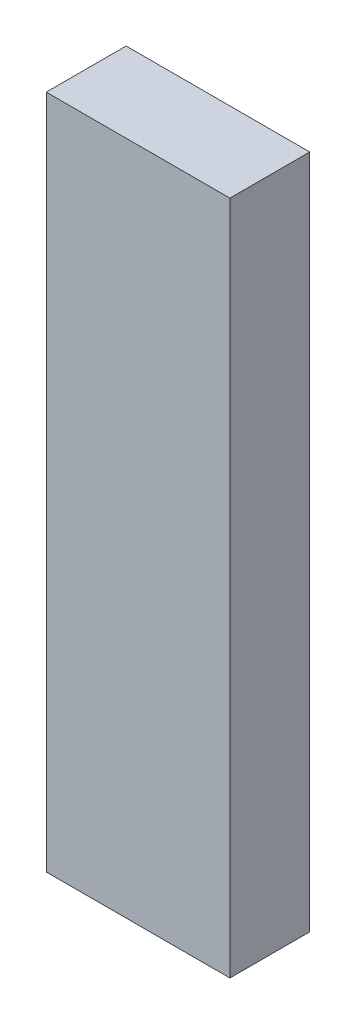
ISO-10303-21;
HEADER;
FILE_DESCRIPTION(('STEP AP214'),'2;1');
FILE_NAME('part.step','',(''),(''),'','','');
FILE_SCHEMA(('AUTOMOTIVE_DESIGN { 1 0 10303 214 1 1 1 1 }'));
ENDSEC;
DATA;
#1=APPLICATION_CONTEXT('core data for automotive mechanical design processes');
#2=APPLICATION_PROTOCOL_DEFINITION('international standard','automotive_design',2000,#1);
#3=PRODUCT_CONTEXT('',#1,'mechanical');
#4=PRODUCT('Part','Part','',(#3));
#5=PRODUCT_RELATED_PRODUCT_CATEGORY('part','',(#4));
#6=PRODUCT_DEFINITION_FORMATION('','',#4);
#7=PRODUCT_DEFINITION_CONTEXT('part definition',#1,'design');
#8=PRODUCT_DEFINITION('design','',#6,#7);
#9=PRODUCT_DEFINITION_SHAPE('','',#8);
#10=(LENGTH_UNIT() NAMED_UNIT(*) SI_UNIT(.MILLI.,.METRE.));
#11=(NAMED_UNIT(*) PLANE_ANGLE_UNIT() SI_UNIT($,.RADIAN.));
#12=(NAMED_UNIT(*) SI_UNIT($,.STERADIAN.) SOLID_ANGLE_UNIT());
#13=UNCERTAINTY_MEASURE_WITH_UNIT(LENGTH_MEASURE(1.E-05),#10,'distance_accuracy_value','');
#14=(GEOMETRIC_REPRESENTATION_CONTEXT(3) GLOBAL_UNCERTAINTY_ASSIGNED_CONTEXT((#13)) GLOBAL_UNIT_ASSIGNED_CONTEXT((#10,
#11,#12)) REPRESENTATION_CONTEXT('',''));
#15=CARTESIAN_POINT('',(0.,0.,0.));
#16=DIRECTION('',(0.,0.,1.));
#17=DIRECTION('',(1.,0.,0.));
#18=AXIS2_PLACEMENT_3D('',#15,#16,#17);
#19=CARTESIAN_POINT('',(7.30000064,26.84999964,0.));
#20=DIRECTION('',(0.,-1.,0.));
#21=DIRECTION('',(-1.,0.,0.));
#22=AXIS2_PLACEMENT_3D('',#19,#20,#21);
#23=PLANE('',#22);
#24=DIRECTION('',(-1.,0.,0.));
#25=VECTOR('',#24,1.);
#26=CARTESIAN_POINT('',(7.30000064,26.84999964,0.));
#27=LINE('',#26,#25);
#28=CARTESIAN_POINT('',(7.30000064,26.84999964,0.));
#29=VERTEX_POINT('',#28);
#30=CARTESIAN_POINT('',(-7.30000064,26.84999964,0.));
#31=VERTEX_POINT('',#30);
#32=EDGE_CURVE('E11',#29,#31,#27,.T.);
#33=ORIENTED_EDGE('',*,*,#32,.T.);
#34=DIRECTION('',(0.,0.,1.));
#35=VECTOR('',#34,1.);
#36=CARTESIAN_POINT('',(-7.30000064,26.84999964,0.));
#37=LINE('',#36,#35);
#38=CARTESIAN_POINT('',(-7.30000064,26.84999964,6.35));
#39=VERTEX_POINT('',#38);
#40=EDGE_CURVE('E24',#31,#39,#37,.T.);
#41=ORIENTED_EDGE('',*,*,#40,.T.);
#42=DIRECTION('',(-1.,0.,0.));
#43=VECTOR('',#42,1.);
#44=CARTESIAN_POINT('',(7.30000064,26.84999964,6.35));
#45=LINE('',#44,#43);
#46=CARTESIAN_POINT('',(7.30000064,26.84999964,6.35));
#47=VERTEX_POINT('',#46);
#48=EDGE_CURVE('E87',#47,#39,#45,.T.);
#49=ORIENTED_EDGE('',*,*,#48,.F.);
#50=DIRECTION('',(0.,0.,1.));
#51=VECTOR('',#50,1.);
#52=CARTESIAN_POINT('',(7.30000064,26.84999964,0.));
#53=LINE('',#52,#51);
#54=EDGE_CURVE('E36',#29,#47,#53,.T.);
#55=ORIENTED_EDGE('',*,*,#54,.F.);
#56=EDGE_LOOP('',(#33,#41,#49,#55));
#57=FACE_BOUND('',#56,.T.);
#58=ADVANCED_FACE('F17',(#57),#23,.F.);
#59=CARTESIAN_POINT('',(-7.30000064,26.84999964,0.));
#60=DIRECTION('',(1.,0.,0.));
#61=DIRECTION('',(0.,-1.,0.));
#62=AXIS2_PLACEMENT_3D('',#59,#60,#61);
#63=PLANE('',#62);
#64=DIRECTION('',(0.,-1.,0.));
#65=VECTOR('',#64,1.);
#66=CARTESIAN_POINT('',(-7.30000064,26.84999964,0.));
#67=LINE('',#66,#65);
#68=CARTESIAN_POINT('',(-7.30000064,-26.84999964,0.));
#69=VERTEX_POINT('',#68);
#70=EDGE_CURVE('E84',#31,#69,#67,.T.);
#71=ORIENTED_EDGE('',*,*,#70,.T.);
#72=DIRECTION('',(0.,0.,1.));
#73=VECTOR('',#72,1.);
#74=CARTESIAN_POINT('',(-7.30000064,-26.84999964,0.));
#75=LINE('',#74,#73);
#76=CARTESIAN_POINT('',(-7.30000064,-26.84999964,6.35));
#77=VERTEX_POINT('',#76);
#78=EDGE_CURVE('E82',#69,#77,#75,.T.);
#79=ORIENTED_EDGE('',*,*,#78,.T.);
#80=DIRECTION('',(0.,-1.,0.));
#81=VECTOR('',#80,1.);
#82=CARTESIAN_POINT('',(-7.30000064,26.84999964,6.35));
#83=LINE('',#82,#81);
#84=EDGE_CURVE('E62',#39,#77,#83,.T.);
#85=ORIENTED_EDGE('',*,*,#84,.F.);
#86=ORIENTED_EDGE('',*,*,#40,.F.);
#87=EDGE_LOOP('',(#71,#79,#85,#86));
#88=FACE_BOUND('',#87,.T.);
#89=ADVANCED_FACE('F89',(#88),#63,.F.);
#90=CARTESIAN_POINT('',(-7.30000064,-26.84999964,0.));
#91=DIRECTION('',(0.,1.,0.));
#92=DIRECTION('',(1.,0.,0.));
#93=AXIS2_PLACEMENT_3D('',#90,#91,#92);
#94=PLANE('',#93);
#95=DIRECTION('',(1.,0.,0.));
#96=VECTOR('',#95,1.);
#97=CARTESIAN_POINT('',(-7.30000064,-26.84999964,0.));
#98=LINE('',#97,#96);
#99=CARTESIAN_POINT('',(7.30000064,-26.84999964,0.));
#100=VERTEX_POINT('',#99);
#101=EDGE_CURVE('E71',#69,#100,#98,.T.);
#102=ORIENTED_EDGE('',*,*,#101,.T.);
#103=DIRECTION('',(0.,0.,1.));
#104=VECTOR('',#103,1.);
#105=CARTESIAN_POINT('',(7.30000064,-26.84999964,0.));
#106=LINE('',#105,#104);
#107=CARTESIAN_POINT('',(7.30000064,-26.84999964,6.35));
#108=VERTEX_POINT('',#107);
#109=EDGE_CURVE('E65',#100,#108,#106,.T.);
#110=ORIENTED_EDGE('',*,*,#109,.T.);
#111=DIRECTION('',(1.,0.,0.));
#112=VECTOR('',#111,1.);
#113=CARTESIAN_POINT('',(-7.30000064,-26.84999964,6.35));
#114=LINE('',#113,#112);
#115=EDGE_CURVE('E57',#77,#108,#114,.T.);
#116=ORIENTED_EDGE('',*,*,#115,.F.);
#117=ORIENTED_EDGE('',*,*,#78,.F.);
#118=EDGE_LOOP('',(#102,#110,#116,#117));
#119=FACE_BOUND('',#118,.T.);
#120=ADVANCED_FACE('F69',(#119),#94,.F.);
#121=CARTESIAN_POINT('',(7.30000064,-26.84999964,0.));
#122=DIRECTION('',(-1.,0.,0.));
#123=DIRECTION('',(0.,1.,0.));
#124=AXIS2_PLACEMENT_3D('',#121,#122,#123);
#125=PLANE('',#124);
#126=DIRECTION('',(0.,1.,0.));
#127=VECTOR('',#126,1.);
#128=CARTESIAN_POINT('',(7.30000064,-26.84999964,0.));
#129=LINE('',#128,#127);
#130=EDGE_CURVE('E66',#100,#29,#129,.T.);
#131=ORIENTED_EDGE('',*,*,#130,.T.);
#132=ORIENTED_EDGE('',*,*,#54,.T.);
#133=DIRECTION('',(0.,1.,0.));
#134=VECTOR('',#133,1.);
#135=CARTESIAN_POINT('',(7.30000064,-26.84999964,6.35));
#136=LINE('',#135,#134);
#137=EDGE_CURVE('E61',#108,#47,#136,.T.);
#138=ORIENTED_EDGE('',*,*,#137,.F.);
#139=ORIENTED_EDGE('',*,*,#109,.F.);
#140=EDGE_LOOP('',(#131,#132,#138,#139));
#141=FACE_BOUND('',#140,.T.);
#142=ADVANCED_FACE('F76',(#141),#125,.F.);
#143=CARTESIAN_POINT('',(0.,0.,0.));
#144=DIRECTION('',(0.,0.,1.));
#145=DIRECTION('',(1.,0.,0.));
#146=AXIS2_PLACEMENT_3D('',#143,#144,#145);
#147=PLANE('',#146);
#148=ORIENTED_EDGE('',*,*,#130,.F.);
#149=ORIENTED_EDGE('',*,*,#101,.F.);
#150=ORIENTED_EDGE('',*,*,#70,.F.);
#151=ORIENTED_EDGE('',*,*,#32,.F.);
#152=EDGE_LOOP('',(#148,#149,#150,#151));
#153=FACE_BOUND('',#152,.T.);
#154=ADVANCED_FACE('F91',(#153),#147,.F.);
#155=CARTESIAN_POINT('',(0.,0.,6.35));
#156=DIRECTION('',(0.,0.,1.));
#157=DIRECTION('',(1.,0.,0.));
#158=AXIS2_PLACEMENT_3D('',#155,#156,#157);
#159=PLANE('',#158);
#160=ORIENTED_EDGE('',*,*,#48,.T.);
#161=ORIENTED_EDGE('',*,*,#84,.T.);
#162=ORIENTED_EDGE('',*,*,#115,.T.);
#163=ORIENTED_EDGE('',*,*,#137,.T.);
#164=EDGE_LOOP('',(#160,#161,#162,#163));
#165=FACE_BOUND('',#164,.T.);
#166=ADVANCED_FACE('F59',(#165),#159,.T.);
#167=CLOSED_SHELL('',(#58,#89,#120,#142,#154,#166));
#168=MANIFOLD_SOLID_BREP('B1',#167);
#169=ADVANCED_BREP_SHAPE_REPRESENTATION('',(#18,#168),#14);
#170=SHAPE_DEFINITION_REPRESENTATION(#9,#169);
ENDSEC;
END-ISO-10303-21;
